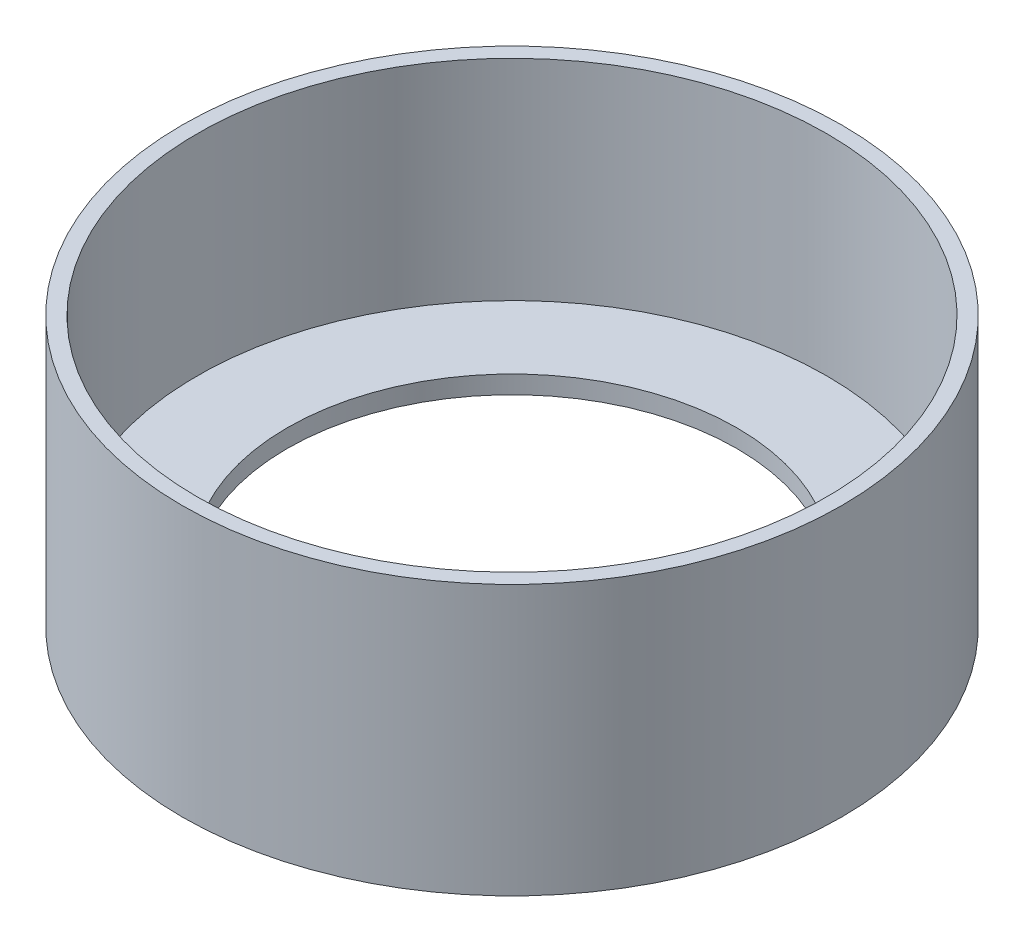
ISO-10303-21;
HEADER;
FILE_DESCRIPTION(('STEP AP214'),'2;1');
FILE_NAME('part.step','',(''),(''),'','','');
FILE_SCHEMA(('AUTOMOTIVE_DESIGN { 1 0 10303 214 1 1 1 1 }'));
ENDSEC;
DATA;
#1=APPLICATION_CONTEXT('core data for automotive mechanical design processes');
#2=APPLICATION_PROTOCOL_DEFINITION('international standard','automotive_design',2000,#1);
#3=PRODUCT_CONTEXT('',#1,'mechanical');
#4=PRODUCT('Part','Part','',(#3));
#5=PRODUCT_RELATED_PRODUCT_CATEGORY('part','',(#4));
#6=PRODUCT_DEFINITION_FORMATION('','',#4);
#7=PRODUCT_DEFINITION_CONTEXT('part definition',#1,'design');
#8=PRODUCT_DEFINITION('design','',#6,#7);
#9=PRODUCT_DEFINITION_SHAPE('','',#8);
#10=(LENGTH_UNIT() NAMED_UNIT(*) SI_UNIT(.MILLI.,.METRE.));
#11=(NAMED_UNIT(*) PLANE_ANGLE_UNIT() SI_UNIT($,.RADIAN.));
#12=(NAMED_UNIT(*) SI_UNIT($,.STERADIAN.) SOLID_ANGLE_UNIT());
#13=UNCERTAINTY_MEASURE_WITH_UNIT(LENGTH_MEASURE(1.E-05),#10,'distance_accuracy_value','');
#14=(GEOMETRIC_REPRESENTATION_CONTEXT(3) GLOBAL_UNCERTAINTY_ASSIGNED_CONTEXT((#13)) GLOBAL_UNIT_ASSIGNED_CONTEXT((#10,
#11,#12)) REPRESENTATION_CONTEXT('',''));
#15=CARTESIAN_POINT('',(0.,0.,0.));
#16=DIRECTION('',(0.,0.,1.));
#17=DIRECTION('',(1.,0.,0.));
#18=AXIS2_PLACEMENT_3D('',#15,#16,#17);
#19=CARTESIAN_POINT('',(0.,-20.,0.));
#20=DIRECTION('',(0.,1.,0.));
#21=DIRECTION('',(0.,0.,1.));
#22=AXIS2_PLACEMENT_3D('',#19,#20,#21);
#23=PLANE('',#22);
#24=CARTESIAN_POINT('',(0.,-20.,0.));
#25=DIRECTION('',(0.,1.,0.));
#26=DIRECTION('',(0.,0.,1.));
#27=AXIS2_PLACEMENT_3D('',#24,#25,#26);
#28=CIRCLE('',#27,105.);
#29=CARTESIAN_POINT('',(0.,-20.,105.));
#30=VERTEX_POINT('',#29);
#31=EDGE_CURVE('E47',#30,#30,#28,.T.);
#32=ORIENTED_EDGE('',*,*,#31,.T.);
#33=EDGE_LOOP('',(#32));
#34=FACE_BOUND('',#33,.T.);
#35=CARTESIAN_POINT('',(0.,-20.,0.));
#36=DIRECTION('',(0.,1.,0.));
#37=DIRECTION('',(0.,0.,1.));
#38=AXIS2_PLACEMENT_3D('',#35,#36,#37);
#39=CIRCLE('',#38,110.);
#40=CARTESIAN_POINT('',(0.,-20.,110.));
#41=VERTEX_POINT('',#40);
#42=EDGE_CURVE('E68',#41,#41,#39,.T.);
#43=ORIENTED_EDGE('',*,*,#42,.F.);
#44=EDGE_LOOP('',(#43));
#45=FACE_BOUND('',#44,.T.);
#46=ADVANCED_FACE('F40',(#34,#45),#23,.F.);
#47=CARTESIAN_POINT('',(0.,70.,0.));
#48=DIRECTION('',(0.,1.,0.));
#49=DIRECTION('',(0.,0.,1.));
#50=AXIS2_PLACEMENT_3D('',#47,#48,#49);
#51=PLANE('',#50);
#52=CARTESIAN_POINT('',(0.,70.,0.));
#53=DIRECTION('',(0.,1.,0.));
#54=DIRECTION('',(0.,0.,1.));
#55=AXIS2_PLACEMENT_3D('',#52,#53,#54);
#56=CIRCLE('',#55,105.);
#57=CARTESIAN_POINT('',(0.,70.,105.));
#58=VERTEX_POINT('',#57);
#59=EDGE_CURVE('E52',#58,#58,#56,.T.);
#60=ORIENTED_EDGE('',*,*,#59,.F.);
#61=EDGE_LOOP('',(#60));
#62=FACE_BOUND('',#61,.T.);
#63=CARTESIAN_POINT('',(0.,70.,0.));
#64=DIRECTION('',(0.,1.,0.));
#65=DIRECTION('',(0.,0.,1.));
#66=AXIS2_PLACEMENT_3D('',#63,#64,#65);
#67=CIRCLE('',#66,110.);
#68=CARTESIAN_POINT('',(0.,70.,110.));
#69=VERTEX_POINT('',#68);
#70=EDGE_CURVE('E72',#69,#69,#67,.T.);
#71=ORIENTED_EDGE('',*,*,#70,.T.);
#72=EDGE_LOOP('',(#71));
#73=FACE_BOUND('',#72,.T.);
#74=ADVANCED_FACE('F84',(#62,#73),#51,.T.);
#75=CARTESIAN_POINT('',(0.,-20.,0.));
#76=DIRECTION('',(0.,1.,0.));
#77=DIRECTION('',(0.,0.,1.));
#78=AXIS2_PLACEMENT_3D('',#75,#76,#77);
#79=CYLINDRICAL_SURFACE('',#78,105.);
#80=ORIENTED_EDGE('',*,*,#31,.F.);
#81=EDGE_LOOP('',(#80));
#82=FACE_BOUND('',#81,.T.);
#83=CARTESIAN_POINT('',(0.,-6.,0.));
#84=DIRECTION('',(0.,1.,0.));
#85=DIRECTION('',(0.,0.,1.));
#86=AXIS2_PLACEMENT_3D('',#83,#84,#85);
#87=CIRCLE('',#86,105.);
#88=CARTESIAN_POINT('',(0.,-6.,105.));
#89=VERTEX_POINT('',#88);
#90=EDGE_CURVE('E10',#89,#89,#87,.F.);
#91=ORIENTED_EDGE('',*,*,#90,.F.);
#92=EDGE_LOOP('',(#91));
#93=FACE_BOUND('',#92,.T.);
#94=ADVANCED_FACE('F88',(#82,#93),#79,.F.);
#95=CARTESIAN_POINT('',(0.,0.,0.));
#96=DIRECTION('',(0.,1.,0.));
#97=DIRECTION('',(0.,0.,1.));
#98=AXIS2_PLACEMENT_3D('',#95,#96,#97);
#99=CIRCLE('',#98,105.);
#100=CARTESIAN_POINT('',(0.,0.,105.));
#101=VERTEX_POINT('',#100);
#102=EDGE_CURVE('E57',#101,#101,#99,.T.);
#103=ORIENTED_EDGE('',*,*,#102,.F.);
#104=EDGE_LOOP('',(#103));
#105=FACE_BOUND('',#104,.T.);
#106=ORIENTED_EDGE('',*,*,#59,.T.);
#107=EDGE_LOOP('',(#106));
#108=FACE_BOUND('',#107,.T.);
#109=ADVANCED_FACE('F94',(#105,#108),#79,.F.);
#110=CARTESIAN_POINT('',(0.,-6.,0.));
#111=DIRECTION('',(0.,1.,0.));
#112=DIRECTION('',(0.,0.,1.));
#113=AXIS2_PLACEMENT_3D('',#110,#111,#112);
#114=PLANE('',#113);
#115=CARTESIAN_POINT('',(0.,-6.,0.));
#116=DIRECTION('',(0.,1.,0.));
#117=DIRECTION('',(0.,0.,1.));
#118=AXIS2_PLACEMENT_3D('',#115,#116,#117);
#119=CIRCLE('',#118,75.);
#120=CARTESIAN_POINT('',(0.,-6.,75.));
#121=VERTEX_POINT('',#120);
#122=EDGE_CURVE('E63',#121,#121,#119,.T.);
#123=ORIENTED_EDGE('',*,*,#122,.T.);
#124=EDGE_LOOP('',(#123));
#125=FACE_BOUND('',#124,.T.);
#126=ORIENTED_EDGE('',*,*,#90,.T.);
#127=EDGE_LOOP('',(#126));
#128=FACE_BOUND('',#127,.T.);
#129=ADVANCED_FACE('F102',(#125,#128),#114,.F.);
#130=CARTESIAN_POINT('',(0.,0.,0.));
#131=DIRECTION('',(0.,1.,0.));
#132=DIRECTION('',(0.,0.,1.));
#133=AXIS2_PLACEMENT_3D('',#130,#131,#132);
#134=PLANE('',#133);
#135=CARTESIAN_POINT('',(0.,0.,0.));
#136=DIRECTION('',(0.,1.,0.));
#137=DIRECTION('',(0.,0.,1.));
#138=AXIS2_PLACEMENT_3D('',#135,#136,#137);
#139=CIRCLE('',#138,75.);
#140=CARTESIAN_POINT('',(0.,0.,75.));
#141=VERTEX_POINT('',#140);
#142=EDGE_CURVE('E64',#141,#141,#139,.T.);
#143=ORIENTED_EDGE('',*,*,#142,.F.);
#144=EDGE_LOOP('',(#143));
#145=FACE_BOUND('',#144,.T.);
#146=ORIENTED_EDGE('',*,*,#102,.T.);
#147=EDGE_LOOP('',(#146));
#148=FACE_BOUND('',#147,.T.);
#149=ADVANCED_FACE('F99',(#145,#148),#134,.T.);
#150=CARTESIAN_POINT('',(0.,-6.,0.));
#151=DIRECTION('',(0.,1.,0.));
#152=DIRECTION('',(0.,0.,1.));
#153=AXIS2_PLACEMENT_3D('',#150,#151,#152);
#154=CYLINDRICAL_SURFACE('',#153,75.);
#155=ORIENTED_EDGE('',*,*,#122,.F.);
#156=EDGE_LOOP('',(#155));
#157=FACE_BOUND('',#156,.T.);
#158=ORIENTED_EDGE('',*,*,#142,.T.);
#159=EDGE_LOOP('',(#158));
#160=FACE_BOUND('',#159,.T.);
#161=ADVANCED_FACE('F112',(#157,#160),#154,.F.);
#162=CARTESIAN_POINT('',(0.,-20.,0.));
#163=DIRECTION('',(0.,1.,0.));
#164=DIRECTION('',(0.,0.,1.));
#165=AXIS2_PLACEMENT_3D('',#162,#163,#164);
#166=CYLINDRICAL_SURFACE('',#165,110.);
#167=CARTESIAN_POINT('',(0.,-20.,110.));
#168=CARTESIAN_POINT('',(0.,-19.0625,110.));
#169=CARTESIAN_POINT('',(0.,-18.125,110.));
#170=CARTESIAN_POINT('',(0.,-16.25,110.));
#171=CARTESIAN_POINT('',(0.,-15.3125,110.));
#172=CARTESIAN_POINT('',(0.,-13.4375,110.));
#173=CARTESIAN_POINT('',(0.,-12.5,110.));
#174=CARTESIAN_POINT('',(0.,-10.625,110.));
#175=CARTESIAN_POINT('',(0.,-9.68750000000001,110.));
#176=CARTESIAN_POINT('',(0.,-7.8125,110.));
#177=CARTESIAN_POINT('',(0.,-6.875,110.));
#178=CARTESIAN_POINT('',(0.,-5.,110.));
#179=CARTESIAN_POINT('',(0.,-4.06250000000001,110.));
#180=CARTESIAN_POINT('',(0.,-2.18750000000001,110.));
#181=CARTESIAN_POINT('',(0.,-1.25000000000001,110.));
#182=CARTESIAN_POINT('',(0.,0.624999999999994,110.));
#183=CARTESIAN_POINT('',(0.,1.56249999999999,110.));
#184=CARTESIAN_POINT('',(0.,3.4375,110.));
#185=CARTESIAN_POINT('',(0.,4.375,110.));
#186=CARTESIAN_POINT('',(0.,6.25,110.));
#187=CARTESIAN_POINT('',(0.,7.1875,110.));
#188=CARTESIAN_POINT('',(0.,9.0625,110.));
#189=CARTESIAN_POINT('',(0.,10.,110.));
#190=CARTESIAN_POINT('',(0.,11.875,110.));
#191=CARTESIAN_POINT('',(0.,12.8125,110.));
#192=CARTESIAN_POINT('',(0.,14.6875,110.));
#193=CARTESIAN_POINT('',(0.,15.625,110.));
#194=CARTESIAN_POINT('',(0.,17.5,110.));
#195=CARTESIAN_POINT('',(0.,18.4375,110.));
#196=CARTESIAN_POINT('',(0.,20.3125,110.));
#197=CARTESIAN_POINT('',(0.,21.25,110.));
#198=CARTESIAN_POINT('',(0.,23.125,110.));
#199=CARTESIAN_POINT('',(0.,24.0625,110.));
#200=CARTESIAN_POINT('',(0.,25.9375,110.));
#201=CARTESIAN_POINT('',(0.,26.875,110.));
#202=CARTESIAN_POINT('',(0.,28.75,110.));
#203=CARTESIAN_POINT('',(0.,29.6875,110.));
#204=CARTESIAN_POINT('',(0.,31.5625,110.));
#205=CARTESIAN_POINT('',(0.,32.5,110.));
#206=CARTESIAN_POINT('',(0.,34.375,110.));
#207=CARTESIAN_POINT('',(0.,35.3125,110.));
#208=CARTESIAN_POINT('',(0.,37.1875,110.));
#209=CARTESIAN_POINT('',(0.,38.125,110.));
#210=CARTESIAN_POINT('',(0.,40.,110.));
#211=CARTESIAN_POINT('',(0.,40.9375,110.));
#212=CARTESIAN_POINT('',(0.,42.8125,110.));
#213=CARTESIAN_POINT('',(0.,43.75,110.));
#214=CARTESIAN_POINT('',(0.,45.625,110.));
#215=CARTESIAN_POINT('',(0.,46.5625,110.));
#216=CARTESIAN_POINT('',(0.,48.4375,110.));
#217=CARTESIAN_POINT('',(0.,49.375,110.));
#218=CARTESIAN_POINT('',(0.,51.25,110.));
#219=CARTESIAN_POINT('',(0.,52.1875,110.));
#220=CARTESIAN_POINT('',(0.,54.0625,110.));
#221=CARTESIAN_POINT('',(0.,55.,110.));
#222=CARTESIAN_POINT('',(0.,56.875,110.));
#223=CARTESIAN_POINT('',(0.,57.8125,110.));
#224=CARTESIAN_POINT('',(0.,59.6875,110.));
#225=CARTESIAN_POINT('',(0.,60.625,110.));
#226=CARTESIAN_POINT('',(0.,62.5,110.));
#227=CARTESIAN_POINT('',(0.,63.4375,110.));
#228=CARTESIAN_POINT('',(0.,65.3125,110.));
#229=CARTESIAN_POINT('',(0.,66.25,110.));
#230=CARTESIAN_POINT('',(0.,68.125,110.));
#231=CARTESIAN_POINT('',(0.,69.0625,110.));
#232=CARTESIAN_POINT('',(0.,70.,110.));
#233=B_SPLINE_CURVE_WITH_KNOTS('',3,(#167,#168,#169,#170,#171,#172,#173,#174,#175,#176,#177,
#178,#179,#180,#181,#182,#183,#184,#185,#186,#187,#188,#189,#190,#191,#192,#193,#194,#195,#196,
#197,#198,#199,#200,#201,#202,#203,#204,#205,#206,#207,#208,#209,#210,#211,#212,#213,#214,#215,
#216,#217,#218,#219,#220,#221,#222,#223,#224,#225,#226,#227,#228,#229,#230,#231,#232),
.UNSPECIFIED.,.F.,.F.,(4,2,2,2,2,2,2,2,2,2,2,2,2,2,2,2,2,2,2,2,2,2,2,2,2,2,2,2,2,2,2,2,4),(0.,
2.8125,5.625,8.4375,11.25,14.0625,16.875,19.6875,22.5,25.3125,28.125,30.9375,33.75,36.5625,
39.375,42.1875,45.,47.8125,50.625,53.4375,56.25,59.0625,61.875,64.6875,67.5,70.3125,73.125,
75.9375,78.75,81.5625,84.375,87.1875,90.),.UNSPECIFIED.);
#234=EDGE_CURVE('BSEAM80',#41,#69,#233,.T.);
#235=ORIENTED_EDGE('',*,*,#42,.T.);
#236=ORIENTED_EDGE('',*,*,#70,.F.);
#237=ORIENTED_EDGE('',*,*,#234,.T.);
#238=ORIENTED_EDGE('',*,*,#234,.F.);
#239=EDGE_LOOP('',(#235,#237,#236,#238));
#240=FACE_BOUND('',#239,.T.);
#241=ADVANCED_FACE('F80',(#240),#166,.T.);
#242=CLOSED_SHELL('',(#46,#74,#94,#109,#129,#149,#161,#241));
#243=MANIFOLD_SOLID_BREP('B2',#242);
#244=ADVANCED_BREP_SHAPE_REPRESENTATION('',(#18,#243),#14);
#245=SHAPE_DEFINITION_REPRESENTATION(#9,#244);
ENDSEC;
END-ISO-10303-21;
